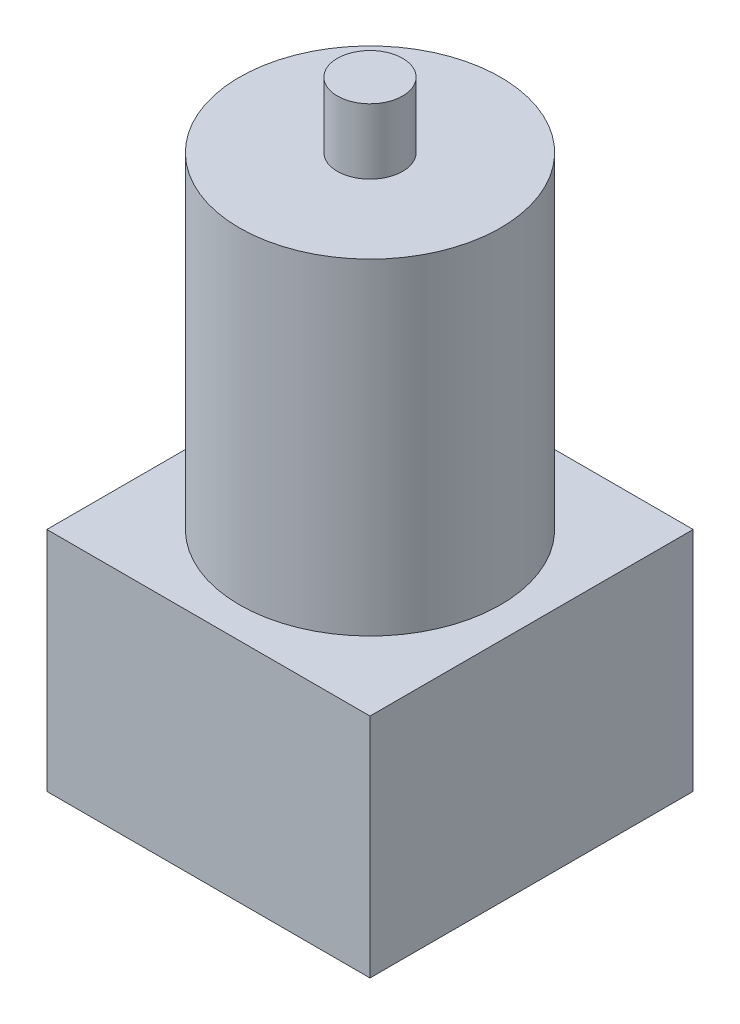
ISO-10303-21;
HEADER;
FILE_DESCRIPTION(('STEP AP214'),'2;1');
FILE_NAME('part.step','',(''),(''),'','','');
FILE_SCHEMA(('AUTOMOTIVE_DESIGN { 1 0 10303 214 1 1 1 1 }'));
ENDSEC;
DATA;
#1=APPLICATION_CONTEXT('core data for automotive mechanical design processes');
#2=APPLICATION_PROTOCOL_DEFINITION('international standard','automotive_design',2000,#1);
#3=PRODUCT_CONTEXT('',#1,'mechanical');
#4=PRODUCT('Part','Part','',(#3));
#5=PRODUCT_RELATED_PRODUCT_CATEGORY('part','',(#4));
#6=PRODUCT_DEFINITION_FORMATION('','',#4);
#7=PRODUCT_DEFINITION_CONTEXT('part definition',#1,'design');
#8=PRODUCT_DEFINITION('design','',#6,#7);
#9=PRODUCT_DEFINITION_SHAPE('','',#8);
#10=(LENGTH_UNIT() NAMED_UNIT(*) SI_UNIT(.MILLI.,.METRE.));
#11=(NAMED_UNIT(*) PLANE_ANGLE_UNIT() SI_UNIT($,.RADIAN.));
#12=(NAMED_UNIT(*) SI_UNIT($,.STERADIAN.) SOLID_ANGLE_UNIT());
#13=UNCERTAINTY_MEASURE_WITH_UNIT(LENGTH_MEASURE(1.E-05),#10,'distance_accuracy_value','');
#14=(GEOMETRIC_REPRESENTATION_CONTEXT(3) GLOBAL_UNCERTAINTY_ASSIGNED_CONTEXT((#13)) GLOBAL_UNIT_ASSIGNED_CONTEXT((#10,
#11,#12)) REPRESENTATION_CONTEXT('',''));
#15=CARTESIAN_POINT('',(0.,0.,0.));
#16=DIRECTION('',(0.,0.,1.));
#17=DIRECTION('',(1.,0.,0.));
#18=AXIS2_PLACEMENT_3D('',#15,#16,#17);
#19=CARTESIAN_POINT('',(0.,50.,0.));
#20=DIRECTION('',(0.,-1.,0.));
#21=DIRECTION('',(0.,0.,-1.));
#22=AXIS2_PLACEMENT_3D('',#19,#20,#21);
#23=CYLINDRICAL_SURFACE('',#22,20.);
#24=CARTESIAN_POINT('',(0.,50.,0.));
#25=DIRECTION('',(0.,1.,0.));
#26=DIRECTION('',(0.,0.,1.));
#27=AXIS2_PLACEMENT_3D('',#24,#25,#26);
#28=CIRCLE('',#27,20.);
#29=CARTESIAN_POINT('',(0.,50.,20.));
#30=VERTEX_POINT('',#29);
#31=EDGE_CURVE('E54',#30,#30,#28,.T.);
#32=ORIENTED_EDGE('',*,*,#31,.F.);
#33=EDGE_LOOP('',(#32));
#34=FACE_BOUND('',#33,.T.);
#35=CARTESIAN_POINT('',(0.,0.,0.));
#36=DIRECTION('',(0.,1.,0.));
#37=DIRECTION('',(0.,0.,1.));
#38=AXIS2_PLACEMENT_3D('',#35,#36,#37);
#39=CIRCLE('',#38,20.);
#40=CARTESIAN_POINT('',(0.,0.,20.));
#41=VERTEX_POINT('',#40);
#42=EDGE_CURVE('E134',#41,#41,#39,.T.);
#43=ORIENTED_EDGE('',*,*,#42,.T.);
#44=EDGE_LOOP('',(#43));
#45=FACE_BOUND('',#44,.T.);
#46=ADVANCED_FACE('F39',(#34,#45),#23,.T.);
#47=CARTESIAN_POINT('',(0.,50.,0.));
#48=DIRECTION('',(0.,1.,0.));
#49=DIRECTION('',(0.,0.,1.));
#50=AXIS2_PLACEMENT_3D('',#47,#48,#49);
#51=PLANE('',#50);
#52=CARTESIAN_POINT('',(0.,50.,0.));
#53=DIRECTION('',(0.,1.,0.));
#54=DIRECTION('',(0.,0.,1.));
#55=AXIS2_PLACEMENT_3D('',#52,#53,#54);
#56=CIRCLE('',#55,5.);
#57=CARTESIAN_POINT('',(0.,50.,5.));
#58=VERTEX_POINT('',#57);
#59=EDGE_CURVE('E11',#58,#58,#56,.T.);
#60=ORIENTED_EDGE('',*,*,#59,.F.);
#61=EDGE_LOOP('',(#60));
#62=FACE_BOUND('',#61,.T.);
#63=ORIENTED_EDGE('',*,*,#31,.T.);
#64=EDGE_LOOP('',(#63));
#65=FACE_BOUND('',#64,.T.);
#66=ADVANCED_FACE('F167',(#62,#65),#51,.T.);
#67=CARTESIAN_POINT('',(0.,60.,0.));
#68=DIRECTION('',(0.,-1.,0.));
#69=DIRECTION('',(0.,0.,-1.));
#70=AXIS2_PLACEMENT_3D('',#67,#68,#69);
#71=CYLINDRICAL_SURFACE('',#70,5.);
#72=CARTESIAN_POINT('',(0.,57.3364901443991,-5.));
#73=CARTESIAN_POINT('',(-0.0822886127533002,57.3364891469142,-4.9999992925055));
#74=CARTESIAN_POINT('',(-0.16458731835153,57.3296962807751,-4.99794915693954));
#75=CARTESIAN_POINT('',(-0.326788125304881,57.302768790177,-4.98997105593691));
#76=CARTESIAN_POINT('',(-0.40668950441142,57.2826301863757,-4.98404193389692));
#77=CARTESIAN_POINT('',(-0.561732707754528,57.2297441274888,-4.96895552501836));
#78=CARTESIAN_POINT('',(-0.636881364395375,57.1970152747801,-4.95980300250425));
#79=CARTESIAN_POINT('',(-0.780624181053133,57.1199540513432,-4.93922109237645));
#80=CARTESIAN_POINT('',(-0.84921746746967,57.0756201370037,-4.92779140192067));
#81=CARTESIAN_POINT('',(-0.979871797183745,56.9752661369264,-4.90350737192774));
#82=CARTESIAN_POINT('',(-1.04171807124434,56.9189735185132,-4.89062383657036));
#83=CARTESIAN_POINT('',(-1.15524920923324,56.7968809144889,-4.86505834210442));
#84=CARTESIAN_POINT('',(-1.20693236327441,56.7310793322741,-4.85237641724501));
#85=CARTESIAN_POINT('',(-1.29980037723708,56.5900193913615,-4.82834113993772));
#86=CARTESIAN_POINT('',(-1.34072309022214,56.5145816834083,-4.81702406663875));
#87=CARTESIAN_POINT('',(-1.4092139477476,56.3575008901688,-4.79743620394031));
#88=CARTESIAN_POINT('',(-1.43678529919973,56.2758593004711,-4.78916468313311));
#89=CARTESIAN_POINT('',(-1.47701633682652,56.1110998782686,-4.77690870838434));
#90=CARTESIAN_POINT('',(-1.49007196234677,56.0280874005351,-4.77281069324533));
#91=CARTESIAN_POINT('',(-1.50213730614672,55.8609569881823,-4.76902789749767));
#92=CARTESIAN_POINT('',(-1.50115042761078,55.77683932634,-4.76934204760571));
#93=CARTESIAN_POINT('',(-1.48546977199812,55.6131062357906,-4.77424744067778));
#94=CARTESIAN_POINT('',(-1.47127205262685,55.5334378940368,-4.7786838859914));
#95=CARTESIAN_POINT('',(-1.43037420427056,55.3776703581256,-4.79108356228624));
#96=CARTESIAN_POINT('',(-1.40367284141641,55.3015715170247,-4.79904714132351));
#97=CARTESIAN_POINT('',(-1.33816026653681,55.1538897947383,-4.81772733074973));
#98=CARTESIAN_POINT('',(-1.29918816934642,55.0823830604438,-4.82848016115952));
#99=CARTESIAN_POINT('',(-1.21035222588683,54.9467581223889,-4.85150987000065));
#100=CARTESIAN_POINT('',(-1.16048574002588,54.8826417149853,-4.86378711746991));
#101=CARTESIAN_POINT('',(-1.04881290765546,54.760803953637,-4.88911011297937));
#102=CARTESIAN_POINT('',(-0.986594907466972,54.7034614803694,-4.90216654310498));
#103=CARTESIAN_POINT('',(-0.853263259313966,54.5999361603348,-4.92712244063259));
#104=CARTESIAN_POINT('',(-0.782149051860887,54.5537540159846,-4.9390218351841));
#105=CARTESIAN_POINT('',(-0.632355038342803,54.4736302219343,-4.9604316006947));
#106=CARTESIAN_POINT('',(-0.55362774974795,54.4397726281492,-4.96992543668314));
#107=CARTESIAN_POINT('',(-0.391245415603519,54.3858905542994,-4.98533521832222));
#108=CARTESIAN_POINT('',(-0.307591751589581,54.3658622158666,-4.99125216186999));
#109=CARTESIAN_POINT('',(-0.140952242668331,54.3408379664997,-4.99868364643538));
#110=CARTESIAN_POINT('',(-0.0580500976011858,54.3353285585975,-5.0003485041779));
#111=CARTESIAN_POINT('',(0.107499605823385,54.3380593001111,-4.9995292324176));
#112=CARTESIAN_POINT('',(0.190147196690783,54.3462976140505,-4.99704565677756));
#113=CARTESIAN_POINT('',(0.350903605309699,54.3758747555106,-4.98830696987163));
#114=CARTESIAN_POINT('',(0.42907277261417,54.3969135319799,-4.98213829799417));
#115=CARTESIAN_POINT('',(0.580754638954522,54.4511333771773,-4.96674347841533));
#116=CARTESIAN_POINT('',(0.654266777025585,54.4843159054369,-4.95751696321085));
#117=CARTESIAN_POINT('',(0.796437189461054,54.5627433098802,-4.93669654351325));
#118=CARTESIAN_POINT('',(0.864943826199671,54.608249485347,-4.92505280829675));
#119=CARTESIAN_POINT('',(0.993523307980149,54.7097148984519,-4.90073468764317));
#120=CARTESIAN_POINT('',(1.05359403235594,54.7656767562867,-4.8880600443108));
#121=CARTESIAN_POINT('',(1.16585744551027,54.8888774527684,-4.86253171869138));
#122=CARTESIAN_POINT('',(1.21768481231504,54.9564520201708,-4.84968825033268));
#123=CARTESIAN_POINT('',(1.30928995072154,55.0996180834126,-4.82576515238463));
#124=CARTESIAN_POINT('',(1.34906803829472,55.1752093689573,-4.81468547654651));
#125=CARTESIAN_POINT('',(1.41517347127168,55.3320226356538,-4.79567189615055));
#126=CARTESIAN_POINT('',(1.4415634693705,55.4132163309357,-4.78772337843827));
#127=CARTESIAN_POINT('',(1.48021730815114,55.5791781133305,-4.77591594362794));
#128=CARTESIAN_POINT('',(1.49248598978779,55.6639449651867,-4.772055625083));
#129=CARTESIAN_POINT('',(1.50221984485059,55.8308516627753,-4.76899972496087));
#130=CARTESIAN_POINT('',(1.5002805530849,55.9129537954166,-4.76961647442754));
#131=CARTESIAN_POINT('',(1.48307505444813,56.0756042477719,-4.77499401288294));
#132=CARTESIAN_POINT('',(1.46780938124716,56.1561526295754,-4.77975463592551));
#133=CARTESIAN_POINT('',(1.42476888804136,56.3124355435419,-4.79275763670385));
#134=CARTESIAN_POINT('',(1.39715175507069,56.3882174317608,-4.80095604545965));
#135=CARTESIAN_POINT('',(1.33031507121129,56.5341325832168,-4.81990278909136));
#136=CARTESIAN_POINT('',(1.29109329962876,56.6042647620398,-4.83065161194312));
#137=CARTESIAN_POINT('',(1.20048763805072,56.7396532609262,-4.85397676425833));
#138=CARTESIAN_POINT('',(1.14871276092994,56.8046389056595,-4.86660540163798));
#139=CARTESIAN_POINT('',(1.03517434629782,56.9251926427069,-4.89201320450026));
#140=CARTESIAN_POINT('',(0.973408217134497,56.9807582838668,-4.90479240823905));
#141=CARTESIAN_POINT('',(0.839465762183243,57.0825135566941,-4.92950936570649));
#142=CARTESIAN_POINT('',(0.767037885790604,57.1283815912546,-4.94141159765674));
#143=CARTESIAN_POINT('',(0.615141373983529,57.2072253143031,-4.96260680455813));
#144=CARTESIAN_POINT('',(0.535676052998955,57.2402070326736,-4.97190099931067));
#145=CARTESIAN_POINT('',(0.380757712655282,57.2893854200518,-4.98602174969301));
#146=CARTESIAN_POINT('',(0.305786961954235,57.3070018172823,-4.99122027381068));
#147=CARTESIAN_POINT('',(0.15388019523078,57.3305536696407,-4.99820944494492));
#148=CARTESIAN_POINT('',(0.0769445098581397,57.3364910771039,-5.0000006615474));
#149=CARTESIAN_POINT('',(0.,57.3364901443991,-5.));
#150=B_SPLINE_CURVE_WITH_KNOTS('',3,(#72,#73,#74,#75,#76,#77,#78,#79,#80,#81,#82,#83,#84,#85,
#86,#87,#88,#89,#90,#91,#92,#93,#94,#95,#96,#97,#98,#99,#100,#101,#102,#103,#104,#105,#106,#107,
#108,#109,#110,#111,#112,#113,#114,#115,#116,#117,#118,#119,#120,#121,#122,#123,#124,#125,#126,
#127,#128,#129,#130,#131,#132,#133,#134,#135,#136,#137,#138,#139,#140,#141,#142,#143,#144,#145,
#146,#147,#148,#149),.UNSPECIFIED.,.T.,.F.,(4,2,2,2,2,2,2,2,2,2,2,2,2,2,2,2,2,2,2,2,2,2,2,2,2,2,
2,2,2,2,2,2,2,2,2,2,2,2,4),(0.,0.246583203612611,0.493239964846,0.739533676300876,
0.985860164412702,1.23855602948191,1.49129437288633,1.7497148100411,2.00807314543224,
2.25919689356599,2.51025978319089,2.75226016697676,2.99428443658002,3.2396242644712,
3.48502360158556,3.74067104048167,3.99633456531072,4.25371046881689,4.51101453528808,
4.75908809438545,5.00712853550327,5.24956746682327,5.49203554593729,5.74011305702909,
5.98825282000191,6.24540400322819,6.50254844252681,6.75847814951252,7.01432009460283,
7.25950155466943,7.504673196616,7.74680040402721,7.98897397553107,8.23996925679931,
8.49102974897503,8.74942996156671,9.00770911595235,9.2383169193046,9.46888616948875),.UNSPECIFIED.);
#151=CARTESIAN_POINT('',(0.,57.3364901443991,-5.));
#152=VERTEX_POINT('',#151);
#153=EDGE_CURVE('E42',#152,#152,#150,.T.);
#154=ORIENTED_EDGE('',*,*,#153,.T.);
#155=EDGE_LOOP('',(#154));
#156=FACE_BOUND('',#155,.T.);
#157=CARTESIAN_POINT('',(0.,60.,0.));
#158=DIRECTION('',(0.,1.,0.));
#159=DIRECTION('',(0.,0.,1.));
#160=AXIS2_PLACEMENT_3D('',#157,#158,#159);
#161=CIRCLE('',#160,5.);
#162=CARTESIAN_POINT('',(0.,60.,5.));
#163=VERTEX_POINT('',#162);
#164=EDGE_CURVE('E139',#163,#163,#161,.T.);
#165=ORIENTED_EDGE('',*,*,#164,.F.);
#166=EDGE_LOOP('',(#165));
#167=FACE_BOUND('',#166,.T.);
#168=ORIENTED_EDGE('',*,*,#59,.T.);
#169=EDGE_LOOP('',(#168));
#170=FACE_BOUND('',#169,.T.);
#171=ADVANCED_FACE('F172',(#156,#167,#170),#71,.T.);
#172=CARTESIAN_POINT('',(0.,60.,0.));
#173=DIRECTION('',(0.,1.,0.));
#174=DIRECTION('',(0.,0.,1.));
#175=AXIS2_PLACEMENT_3D('',#172,#173,#174);
#176=PLANE('',#175);
#177=ORIENTED_EDGE('',*,*,#164,.T.);
#178=EDGE_LOOP('',(#177));
#179=FACE_BOUND('',#178,.T.);
#180=ADVANCED_FACE('F179',(#179),#176,.T.);
#181=CARTESIAN_POINT('',(0.,55.8364901443991,-16.));
#182=DIRECTION('',(0.,0.,1.));
#183=DIRECTION('',(1.,0.,0.));
#184=AXIS2_PLACEMENT_3D('',#181,#182,#183);
#185=CYLINDRICAL_SURFACE('',#184,1.5);
#186=CARTESIAN_POINT('',(0.,55.8364901443991,0.));
#187=DIRECTION('',(0.,0.,1.));
#188=DIRECTION('',(1.,0.,0.));
#189=AXIS2_PLACEMENT_3D('',#186,#187,#188);
#190=CIRCLE('',#189,1.5);
#191=CARTESIAN_POINT('',(1.5,55.8364901443991,0.));
#192=VERTEX_POINT('',#191);
#193=EDGE_CURVE('E135',#192,#192,#190,.T.);
#194=ORIENTED_EDGE('',*,*,#193,.T.);
#195=EDGE_LOOP('',(#194));
#196=FACE_BOUND('',#195,.T.);
#197=ORIENTED_EDGE('',*,*,#153,.F.);
#198=EDGE_LOOP('',(#197));
#199=FACE_BOUND('',#198,.T.);
#200=ADVANCED_FACE('F185',(#196,#199),#185,.F.);
#201=CARTESIAN_POINT('',(0.,55.8364901443991,0.));
#202=DIRECTION('',(0.,0.,1.));
#203=DIRECTION('',(1.,0.,0.));
#204=AXIS2_PLACEMENT_3D('',#201,#202,#203);
#205=PLANE('',#204);
#206=ORIENTED_EDGE('',*,*,#193,.F.);
#207=EDGE_LOOP('',(#206));
#208=FACE_BOUND('',#207,.T.);
#209=ADVANCED_FACE('F190',(#208),#205,.F.);
#210=CARTESIAN_POINT('',(24.75,-34.75,24.75));
#211=DIRECTION('',(-1.,0.,0.));
#212=DIRECTION('',(0.,0.,1.));
#213=AXIS2_PLACEMENT_3D('',#210,#211,#212);
#214=PLANE('',#213);
#215=DIRECTION('',(0.,0.,1.));
#216=VECTOR('',#215,1.);
#217=CARTESIAN_POINT('',(24.75,0.,24.75));
#218=LINE('',#217,#216);
#219=CARTESIAN_POINT('',(24.75,0.,-24.75));
#220=VERTEX_POINT('',#219);
#221=CARTESIAN_POINT('',(24.75,0.,24.75));
#222=VERTEX_POINT('',#221);
#223=EDGE_CURVE('E118',#220,#222,#218,.T.);
#224=ORIENTED_EDGE('',*,*,#223,.T.);
#225=DIRECTION('',(0.,1.,0.));
#226=VECTOR('',#225,1.);
#227=CARTESIAN_POINT('',(24.75,-34.75,24.75));
#228=LINE('',#227,#226);
#229=CARTESIAN_POINT('',(24.75,-34.75,24.75));
#230=VERTEX_POINT('',#229);
#231=EDGE_CURVE('E107',#230,#222,#228,.T.);
#232=ORIENTED_EDGE('',*,*,#231,.F.);
#233=DIRECTION('',(0.,0.,1.));
#234=VECTOR('',#233,1.);
#235=CARTESIAN_POINT('',(24.75,-34.75,24.75));
#236=LINE('',#235,#234);
#237=CARTESIAN_POINT('',(24.75,-34.75,-24.75));
#238=VERTEX_POINT('',#237);
#239=EDGE_CURVE('E99',#238,#230,#236,.T.);
#240=ORIENTED_EDGE('',*,*,#239,.F.);
#241=DIRECTION('',(0.,1.,0.));
#242=VECTOR('',#241,1.);
#243=CARTESIAN_POINT('',(24.75,-34.75,-24.75));
#244=LINE('',#243,#242);
#245=EDGE_CURVE('E114',#238,#220,#244,.T.);
#246=ORIENTED_EDGE('',*,*,#245,.T.);
#247=EDGE_LOOP('',(#224,#232,#240,#246));
#248=FACE_BOUND('',#247,.T.);
#249=ADVANCED_FACE('F156',(#248),#214,.F.);
#250=CARTESIAN_POINT('',(-24.75,-34.75,24.75));
#251=DIRECTION('',(0.,0.,-1.));
#252=DIRECTION('',(-1.,0.,0.));
#253=AXIS2_PLACEMENT_3D('',#250,#251,#252);
#254=PLANE('',#253);
#255=DIRECTION('',(-1.,0.,0.));
#256=VECTOR('',#255,1.);
#257=CARTESIAN_POINT('',(-24.75,0.,24.75));
#258=LINE('',#257,#256);
#259=CARTESIAN_POINT('',(-24.75,0.,24.75));
#260=VERTEX_POINT('',#259);
#261=EDGE_CURVE('E105',#222,#260,#258,.T.);
#262=ORIENTED_EDGE('',*,*,#261,.T.);
#263=DIRECTION('',(0.,1.,0.));
#264=VECTOR('',#263,1.);
#265=CARTESIAN_POINT('',(-24.75,-34.75,24.75));
#266=LINE('',#265,#264);
#267=CARTESIAN_POINT('',(-24.75,-34.75,24.75));
#268=VERTEX_POINT('',#267);
#269=EDGE_CURVE('E103',#268,#260,#266,.T.);
#270=ORIENTED_EDGE('',*,*,#269,.F.);
#271=DIRECTION('',(-1.,0.,0.));
#272=VECTOR('',#271,1.);
#273=CARTESIAN_POINT('',(-24.75,-34.75,24.75));
#274=LINE('',#273,#272);
#275=EDGE_CURVE('E94',#230,#268,#274,.T.);
#276=ORIENTED_EDGE('',*,*,#275,.F.);
#277=ORIENTED_EDGE('',*,*,#231,.T.);
#278=EDGE_LOOP('',(#262,#270,#276,#277));
#279=FACE_BOUND('',#278,.T.);
#280=ADVANCED_FACE('F104',(#279),#254,.F.);
#281=CARTESIAN_POINT('',(-24.75,-34.75,24.75));
#282=DIRECTION('',(1.,0.,0.));
#283=DIRECTION('',(0.,0.,-1.));
#284=AXIS2_PLACEMENT_3D('',#281,#282,#283);
#285=PLANE('',#284);
#286=DIRECTION('',(0.,0.,-1.));
#287=VECTOR('',#286,1.);
#288=CARTESIAN_POINT('',(-24.75,0.,24.75));
#289=LINE('',#288,#287);
#290=CARTESIAN_POINT('',(-24.75,0.,-24.75));
#291=VERTEX_POINT('',#290);
#292=EDGE_CURVE('E80',#260,#291,#289,.T.);
#293=ORIENTED_EDGE('',*,*,#292,.T.);
#294=DIRECTION('',(0.,1.,0.));
#295=VECTOR('',#294,1.);
#296=CARTESIAN_POINT('',(-24.75,-34.75,-24.75));
#297=LINE('',#296,#295);
#298=CARTESIAN_POINT('',(-24.75,-34.75,-24.75));
#299=VERTEX_POINT('',#298);
#300=EDGE_CURVE('E108',#299,#291,#297,.T.);
#301=ORIENTED_EDGE('',*,*,#300,.F.);
#302=DIRECTION('',(0.,0.,-1.));
#303=VECTOR('',#302,1.);
#304=CARTESIAN_POINT('',(-24.75,-34.75,24.75));
#305=LINE('',#304,#303);
#306=EDGE_CURVE('E97',#268,#299,#305,.T.);
#307=ORIENTED_EDGE('',*,*,#306,.F.);
#308=ORIENTED_EDGE('',*,*,#269,.T.);
#309=EDGE_LOOP('',(#293,#301,#307,#308));
#310=FACE_BOUND('',#309,.T.);
#311=ADVANCED_FACE('F110',(#310),#285,.F.);
#312=CARTESIAN_POINT('',(-24.75,-34.75,-24.75));
#313=DIRECTION('',(0.,0.,1.));
#314=DIRECTION('',(1.,0.,0.));
#315=AXIS2_PLACEMENT_3D('',#312,#313,#314);
#316=PLANE('',#315);
#317=DIRECTION('',(1.,0.,0.));
#318=VECTOR('',#317,1.);
#319=CARTESIAN_POINT('',(-24.75,0.,-24.75));
#320=LINE('',#319,#318);
#321=EDGE_CURVE('E86',#291,#220,#320,.T.);
#322=ORIENTED_EDGE('',*,*,#321,.T.);
#323=ORIENTED_EDGE('',*,*,#245,.F.);
#324=DIRECTION('',(1.,0.,0.));
#325=VECTOR('',#324,1.);
#326=CARTESIAN_POINT('',(-24.75,-34.75,-24.75));
#327=LINE('',#326,#325);
#328=EDGE_CURVE('E63',#299,#238,#327,.T.);
#329=ORIENTED_EDGE('',*,*,#328,.F.);
#330=ORIENTED_EDGE('',*,*,#300,.T.);
#331=EDGE_LOOP('',(#322,#323,#329,#330));
#332=FACE_BOUND('',#331,.T.);
#333=ADVANCED_FACE('F157',(#332),#316,.F.);
#334=CARTESIAN_POINT('',(0.,-34.75,0.));
#335=DIRECTION('',(0.,-1.,0.));
#336=DIRECTION('',(0.,0.,-1.));
#337=AXIS2_PLACEMENT_3D('',#334,#335,#336);
#338=PLANE('',#337);
#339=ORIENTED_EDGE('',*,*,#239,.T.);
#340=ORIENTED_EDGE('',*,*,#275,.T.);
#341=ORIENTED_EDGE('',*,*,#306,.T.);
#342=ORIENTED_EDGE('',*,*,#328,.T.);
#343=EDGE_LOOP('',(#339,#340,#341,#342));
#344=FACE_BOUND('',#343,.T.);
#345=ADVANCED_FACE('F95',(#344),#338,.T.);
#346=CARTESIAN_POINT('',(0.,0.,0.));
#347=DIRECTION('',(0.,-1.,0.));
#348=DIRECTION('',(0.,0.,-1.));
#349=AXIS2_PLACEMENT_3D('',#346,#347,#348);
#350=PLANE('',#349);
#351=ORIENTED_EDGE('',*,*,#42,.F.);
#352=EDGE_LOOP('',(#351));
#353=FACE_BOUND('',#352,.T.);
#354=ORIENTED_EDGE('',*,*,#223,.F.);
#355=ORIENTED_EDGE('',*,*,#321,.F.);
#356=ORIENTED_EDGE('',*,*,#292,.F.);
#357=ORIENTED_EDGE('',*,*,#261,.F.);
#358=EDGE_LOOP('',(#354,#355,#356,#357));
#359=FACE_BOUND('',#358,.T.);
#360=ADVANCED_FACE('F150',(#353,#359),#350,.F.);
#361=CLOSED_SHELL('',(#46,#66,#171,#180,#200,#209,#249,#280,#311,#333,#345,#360));
#362=MANIFOLD_SOLID_BREP('B2',#361);
#363=ADVANCED_BREP_SHAPE_REPRESENTATION('',(#18,#362),#14);
#364=SHAPE_DEFINITION_REPRESENTATION(#9,#363);
ENDSEC;
END-ISO-10303-21;
